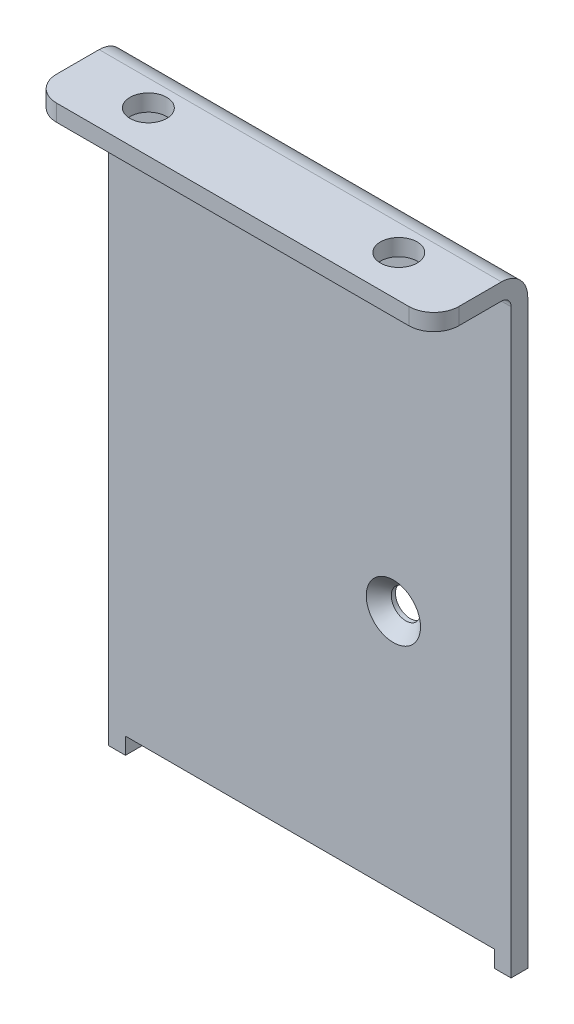
ISO-10303-21;
HEADER;
FILE_DESCRIPTION(('STEP AP214'),'2;1');
FILE_NAME('part.step','',(''),(''),'','','');
FILE_SCHEMA(('AUTOMOTIVE_DESIGN { 1 0 10303 214 1 1 1 1 }'));
ENDSEC;
DATA;
#1=APPLICATION_CONTEXT('core data for automotive mechanical design processes');
#2=APPLICATION_PROTOCOL_DEFINITION('international standard','automotive_design',2000,#1);
#3=PRODUCT_CONTEXT('',#1,'mechanical');
#4=PRODUCT('Part','Part','',(#3));
#5=PRODUCT_RELATED_PRODUCT_CATEGORY('part','',(#4));
#6=PRODUCT_DEFINITION_FORMATION('','',#4);
#7=PRODUCT_DEFINITION_CONTEXT('part definition',#1,'design');
#8=PRODUCT_DEFINITION('design','',#6,#7);
#9=PRODUCT_DEFINITION_SHAPE('','',#8);
#10=(LENGTH_UNIT() NAMED_UNIT(*) SI_UNIT(.MILLI.,.METRE.));
#11=(NAMED_UNIT(*) PLANE_ANGLE_UNIT() SI_UNIT($,.RADIAN.));
#12=(NAMED_UNIT(*) SI_UNIT($,.STERADIAN.) SOLID_ANGLE_UNIT());
#13=UNCERTAINTY_MEASURE_WITH_UNIT(LENGTH_MEASURE(1.E-05),#10,'distance_accuracy_value','');
#14=(GEOMETRIC_REPRESENTATION_CONTEXT(3) GLOBAL_UNCERTAINTY_ASSIGNED_CONTEXT((#13)) GLOBAL_UNIT_ASSIGNED_CONTEXT((#10,
#11,#12)) REPRESENTATION_CONTEXT('',''));
#15=CARTESIAN_POINT('',(0.,0.,0.));
#16=DIRECTION('',(0.,0.,1.));
#17=DIRECTION('',(1.,0.,0.));
#18=AXIS2_PLACEMENT_3D('',#15,#16,#17);
#19=CARTESIAN_POINT('',(24.1,57.8,0.));
#20=DIRECTION('',(0.,-1.,0.));
#21=DIRECTION('',(0.,0.,-1.));
#22=AXIS2_PLACEMENT_3D('',#19,#20,#21);
#23=PLANE('',#22);
#24=DIRECTION('',(0.,0.,1.));
#25=VECTOR('',#24,1.);
#26=CARTESIAN_POINT('',(-24.1,57.8,1.15));
#27=LINE('',#26,#25);
#28=CARTESIAN_POINT('',(-24.1,57.8,1.15));
#29=VERTEX_POINT('',#28);
#30=CARTESIAN_POINT('',(-24.1,57.8,6.25));
#31=VERTEX_POINT('',#30);
#32=EDGE_CURVE('E115',#29,#31,#27,.T.);
#33=ORIENTED_EDGE('',*,*,#32,.F.);
#34=DIRECTION('',(-1.,0.,0.));
#35=VECTOR('',#34,1.);
#36=CARTESIAN_POINT('',(24.1,57.8,1.15));
#37=LINE('',#36,#35);
#38=CARTESIAN_POINT('',(24.1,57.8,1.15));
#39=VERTEX_POINT('',#38);
#40=EDGE_CURVE('E145',#29,#39,#37,.F.);
#41=ORIENTED_EDGE('',*,*,#40,.T.);
#42=DIRECTION('',(0.,0.,-1.));
#43=VECTOR('',#42,1.);
#44=CARTESIAN_POINT('',(24.1,57.8,-2.));
#45=LINE('',#44,#43);
#46=CARTESIAN_POINT('',(24.1,57.8,6.25));
#47=VERTEX_POINT('',#46);
#48=EDGE_CURVE('E128',#47,#39,#45,.T.);
#49=ORIENTED_EDGE('',*,*,#48,.F.);
#50=CARTESIAN_POINT('',(21.1,57.8,6.25));
#51=DIRECTION('',(0.,1.,0.));
#52=DIRECTION('',(0.,0.,1.));
#53=AXIS2_PLACEMENT_3D('',#50,#51,#52);
#54=CIRCLE('',#53,3.);
#55=CARTESIAN_POINT('',(21.1,57.8,9.25));
#56=VERTEX_POINT('',#55);
#57=EDGE_CURVE('E139',#56,#47,#54,.T.);
#58=ORIENTED_EDGE('',*,*,#57,.F.);
#59=DIRECTION('',(1.,0.,0.));
#60=VECTOR('',#59,1.);
#61=CARTESIAN_POINT('',(24.1,57.8,9.25));
#62=LINE('',#61,#60);
#63=CARTESIAN_POINT('',(-21.1,57.8,9.25));
#64=VERTEX_POINT('',#63);
#65=EDGE_CURVE('E135',#64,#56,#62,.T.);
#66=ORIENTED_EDGE('',*,*,#65,.F.);
#67=CARTESIAN_POINT('',(-21.1,57.8,6.25));
#68=DIRECTION('',(0.,1.,0.));
#69=DIRECTION('',(0.,0.,1.));
#70=AXIS2_PLACEMENT_3D('',#67,#68,#69);
#71=CIRCLE('',#70,3.);
#72=EDGE_CURVE('E132',#31,#64,#71,.T.);
#73=ORIENTED_EDGE('',*,*,#72,.F.);
#74=EDGE_LOOP('',(#33,#41,#49,#58,#66,#73));
#75=FACE_BOUND('',#74,.T.);
#76=CARTESIAN_POINT('',(-15.1,57.8,4.25));
#77=DIRECTION('',(0.,1.,0.));
#78=DIRECTION('',(0.,0.,1.));
#79=AXIS2_PLACEMENT_3D('',#76,#77,#78);
#80=CIRCLE('',#79,2.2);
#81=CARTESIAN_POINT('',(-15.1,57.8,6.45));
#82=VERTEX_POINT('',#81);
#83=EDGE_CURVE('E140',#82,#82,#80,.T.);
#84=ORIENTED_EDGE('',*,*,#83,.T.);
#85=EDGE_LOOP('',(#84));
#86=FACE_BOUND('',#85,.T.);
#87=CARTESIAN_POINT('',(14.9,57.8,4.25));
#88=DIRECTION('',(0.,1.,0.));
#89=DIRECTION('',(0.,0.,1.));
#90=AXIS2_PLACEMENT_3D('',#87,#88,#89);
#91=CIRCLE('',#90,2.2);
#92=CARTESIAN_POINT('',(14.9,57.8,6.45));
#93=VERTEX_POINT('',#92);
#94=EDGE_CURVE('E20',#93,#93,#91,.T.);
#95=ORIENTED_EDGE('',*,*,#94,.T.);
#96=EDGE_LOOP('',(#95));
#97=FACE_BOUND('',#96,.T.);
#98=ADVANCED_FACE('F17',(#75,#86,#97),#23,.T.);
#99=CARTESIAN_POINT('',(14.9,59.8,4.25));
#100=DIRECTION('',(0.,1.,0.));
#101=DIRECTION('',(0.,0.,1.));
#102=AXIS2_PLACEMENT_3D('',#99,#100,#101);
#103=CYLINDRICAL_SURFACE('',#102,2.2);
#104=ORIENTED_EDGE('',*,*,#94,.F.);
#105=EDGE_LOOP('',(#104));
#106=FACE_BOUND('',#105,.T.);
#107=CARTESIAN_POINT('',(14.9,59.8,4.25));
#108=DIRECTION('',(0.,1.,0.));
#109=DIRECTION('',(0.,0.,1.));
#110=AXIS2_PLACEMENT_3D('',#107,#108,#109);
#111=CIRCLE('',#110,2.2);
#112=CARTESIAN_POINT('',(14.9,59.8,6.45));
#113=VERTEX_POINT('',#112);
#114=EDGE_CURVE('E147',#113,#113,#111,.T.);
#115=ORIENTED_EDGE('',*,*,#114,.T.);
#116=EDGE_LOOP('',(#115));
#117=FACE_BOUND('',#116,.T.);
#118=ADVANCED_FACE('F192',(#106,#117),#103,.F.);
#119=CARTESIAN_POINT('',(-15.1,59.8,4.25));
#120=DIRECTION('',(0.,1.,0.));
#121=DIRECTION('',(0.,0.,1.));
#122=AXIS2_PLACEMENT_3D('',#119,#120,#121);
#123=CYLINDRICAL_SURFACE('',#122,2.2);
#124=ORIENTED_EDGE('',*,*,#83,.F.);
#125=EDGE_LOOP('',(#124));
#126=FACE_BOUND('',#125,.T.);
#127=CARTESIAN_POINT('',(-15.1,59.8,4.25));
#128=DIRECTION('',(0.,1.,0.));
#129=DIRECTION('',(0.,0.,1.));
#130=AXIS2_PLACEMENT_3D('',#127,#128,#129);
#131=CIRCLE('',#130,2.2);
#132=CARTESIAN_POINT('',(-15.1,59.8,6.45));
#133=VERTEX_POINT('',#132);
#134=EDGE_CURVE('E181',#133,#133,#131,.T.);
#135=ORIENTED_EDGE('',*,*,#134,.T.);
#136=EDGE_LOOP('',(#135));
#137=FACE_BOUND('',#136,.T.);
#138=ADVANCED_FACE('F195',(#126,#137),#123,.F.);
#139=CARTESIAN_POINT('',(-21.1,56.65,6.25));
#140=DIRECTION('',(0.,1.,0.));
#141=DIRECTION('',(0.,0.,1.));
#142=AXIS2_PLACEMENT_3D('',#139,#140,#141);
#143=CYLINDRICAL_SURFACE('',#142,3.);
#144=CARTESIAN_POINT('',(-21.1,59.8,6.25));
#145=DIRECTION('',(0.,1.,0.));
#146=DIRECTION('',(0.,0.,1.));
#147=AXIS2_PLACEMENT_3D('',#144,#145,#146);
#148=CIRCLE('',#147,3.);
#149=CARTESIAN_POINT('',(-21.1,59.8,9.25));
#150=VERTEX_POINT('',#149);
#151=CARTESIAN_POINT('',(-24.1,59.8,6.25));
#152=VERTEX_POINT('',#151);
#153=EDGE_CURVE('E144',#150,#152,#148,.F.);
#154=ORIENTED_EDGE('',*,*,#153,.T.);
#155=DIRECTION('',(0.,1.,0.));
#156=VECTOR('',#155,1.);
#157=CARTESIAN_POINT('',(-24.1,56.65,6.25));
#158=LINE('',#157,#156);
#159=EDGE_CURVE('E121',#31,#152,#158,.T.);
#160=ORIENTED_EDGE('',*,*,#159,.F.);
#161=ORIENTED_EDGE('',*,*,#72,.T.);
#162=DIRECTION('',(0.,1.,0.));
#163=VECTOR('',#162,1.);
#164=CARTESIAN_POINT('',(-21.1,57.8,9.25));
#165=LINE('',#164,#163);
#166=EDGE_CURVE('E274',#150,#64,#165,.F.);
#167=ORIENTED_EDGE('',*,*,#166,.F.);
#168=EDGE_LOOP('',(#154,#160,#161,#167));
#169=FACE_BOUND('',#168,.T.);
#170=ADVANCED_FACE('F143',(#169),#143,.T.);
#171=CARTESIAN_POINT('',(21.1,57.8,6.25));
#172=DIRECTION('',(0.,1.,0.));
#173=DIRECTION('',(0.,0.,1.));
#174=AXIS2_PLACEMENT_3D('',#171,#172,#173);
#175=CYLINDRICAL_SURFACE('',#174,3.);
#176=CARTESIAN_POINT('',(21.1,59.8,6.25));
#177=DIRECTION('',(0.,1.,0.));
#178=DIRECTION('',(0.,0.,1.));
#179=AXIS2_PLACEMENT_3D('',#176,#177,#178);
#180=CIRCLE('',#179,3.);
#181=CARTESIAN_POINT('',(24.1,59.8,6.25));
#182=VERTEX_POINT('',#181);
#183=CARTESIAN_POINT('',(21.1,59.8,9.25));
#184=VERTEX_POINT('',#183);
#185=EDGE_CURVE('E175',#182,#184,#180,.F.);
#186=ORIENTED_EDGE('',*,*,#185,.T.);
#187=DIRECTION('',(0.,1.,0.));
#188=VECTOR('',#187,1.);
#189=CARTESIAN_POINT('',(21.1,57.8,9.25));
#190=LINE('',#189,#188);
#191=EDGE_CURVE('E154',#56,#184,#190,.T.);
#192=ORIENTED_EDGE('',*,*,#191,.F.);
#193=ORIENTED_EDGE('',*,*,#57,.T.);
#194=DIRECTION('',(0.,1.,0.));
#195=VECTOR('',#194,1.);
#196=CARTESIAN_POINT('',(24.1,56.65,6.25));
#197=LINE('',#196,#195);
#198=EDGE_CURVE('E151',#182,#47,#197,.F.);
#199=ORIENTED_EDGE('',*,*,#198,.F.);
#200=EDGE_LOOP('',(#186,#192,#193,#199));
#201=FACE_BOUND('',#200,.T.);
#202=ADVANCED_FACE('F373',(#201),#175,.T.);
#203=CARTESIAN_POINT('',(24.1,57.8,9.25));
#204=DIRECTION('',(0.,0.,1.));
#205=DIRECTION('',(1.,0.,0.));
#206=AXIS2_PLACEMENT_3D('',#203,#204,#205);
#207=PLANE('',#206);
#208=DIRECTION('',(1.,0.,0.));
#209=VECTOR('',#208,1.);
#210=CARTESIAN_POINT('',(24.1,59.8,9.25));
#211=LINE('',#210,#209);
#212=EDGE_CURVE('E174',#184,#150,#211,.F.);
#213=ORIENTED_EDGE('',*,*,#212,.T.);
#214=ORIENTED_EDGE('',*,*,#166,.T.);
#215=ORIENTED_EDGE('',*,*,#65,.T.);
#216=ORIENTED_EDGE('',*,*,#191,.T.);
#217=EDGE_LOOP('',(#213,#214,#215,#216));
#218=FACE_BOUND('',#217,.T.);
#219=ADVANCED_FACE('F374',(#218),#207,.T.);
#220=CARTESIAN_POINT('',(24.1,56.65,1.15));
#221=DIRECTION('',(-1.,0.,0.));
#222=DIRECTION('',(0.,0.,1.));
#223=AXIS2_PLACEMENT_3D('',#220,#221,#222);
#224=CYLINDRICAL_SURFACE('',#223,1.15);
#225=DIRECTION('',(1.,0.,0.));
#226=VECTOR('',#225,1.);
#227=CARTESIAN_POINT('',(24.1,56.65,0.));
#228=LINE('',#227,#226);
#229=CARTESIAN_POINT('',(24.1,56.65,0.));
#230=VERTEX_POINT('',#229);
#231=CARTESIAN_POINT('',(-24.1,56.65,0.));
#232=VERTEX_POINT('',#231);
#233=EDGE_CURVE('E170',#230,#232,#228,.F.);
#234=ORIENTED_EDGE('',*,*,#233,.F.);
#235=CARTESIAN_POINT('',(24.1,56.65,1.15));
#236=DIRECTION('',(-1.,0.,0.));
#237=DIRECTION('',(0.,0.,1.));
#238=AXIS2_PLACEMENT_3D('',#235,#236,#237);
#239=CIRCLE('',#238,1.15);
#240=EDGE_CURVE('E172',#39,#230,#239,.T.);
#241=ORIENTED_EDGE('',*,*,#240,.F.);
#242=ORIENTED_EDGE('',*,*,#40,.F.);
#243=CARTESIAN_POINT('',(-24.1,56.65,1.15));
#244=DIRECTION('',(-1.,0.,0.));
#245=DIRECTION('',(0.,0.,1.));
#246=AXIS2_PLACEMENT_3D('',#243,#244,#245);
#247=CIRCLE('',#246,1.15);
#248=EDGE_CURVE('E125',#232,#29,#247,.F.);
#249=ORIENTED_EDGE('',*,*,#248,.F.);
#250=EDGE_LOOP('',(#234,#241,#242,#249));
#251=FACE_BOUND('',#250,.T.);
#252=ADVANCED_FACE('F212',(#251),#224,.F.);
#253=CARTESIAN_POINT('',(10.,18.,0.));
#254=DIRECTION('',(0.,0.,1.));
#255=DIRECTION('',(1.,0.,0.));
#256=AXIS2_PLACEMENT_3D('',#253,#254,#255);
#257=CONICAL_SURFACE('',#256,3.25000000008458,0.785398163397448);
#258=CARTESIAN_POINT('',(10.,18.,-1.49999999999999));
#259=DIRECTION('',(0.,0.,1.));
#260=DIRECTION('',(1.,0.,0.));
#261=AXIS2_PLACEMENT_3D('',#258,#259,#260);
#262=CIRCLE('',#261,1.75);
#263=CARTESIAN_POINT('',(11.75,18.,-1.49999999999999));
#264=VERTEX_POINT('',#263);
#265=EDGE_CURVE('E263',#264,#264,#262,.F.);
#266=ORIENTED_EDGE('',*,*,#265,.T.);
#267=EDGE_LOOP('',(#266));
#268=FACE_BOUND('',#267,.T.);
#269=CARTESIAN_POINT('',(10.,18.,0.));
#270=DIRECTION('',(0.,0.,1.));
#271=DIRECTION('',(1.,0.,0.));
#272=AXIS2_PLACEMENT_3D('',#269,#270,#271);
#273=CIRCLE('',#272,3.25000000008458);
#274=CARTESIAN_POINT('',(13.2500000000846,18.,0.));
#275=VERTEX_POINT('',#274);
#276=EDGE_CURVE('E167',#275,#275,#273,.F.);
#277=ORIENTED_EDGE('',*,*,#276,.F.);
#278=EDGE_LOOP('',(#277));
#279=FACE_BOUND('',#278,.T.);
#280=ADVANCED_FACE('F201',(#268,#279),#257,.F.);
#281=CARTESIAN_POINT('',(24.1,59.8,0.));
#282=DIRECTION('',(0.,-1.,0.));
#283=DIRECTION('',(0.,0.,-1.));
#284=AXIS2_PLACEMENT_3D('',#281,#282,#283);
#285=PLANE('',#284);
#286=ORIENTED_EDGE('',*,*,#185,.F.);
#287=DIRECTION('',(0.,0.,-1.));
#288=VECTOR('',#287,1.);
#289=CARTESIAN_POINT('',(24.1,59.8,0.));
#290=LINE('',#289,#288);
#291=CARTESIAN_POINT('',(24.1,59.8,1.15));
#292=VERTEX_POINT('',#291);
#293=EDGE_CURVE('E178',#292,#182,#290,.F.);
#294=ORIENTED_EDGE('',*,*,#293,.F.);
#295=DIRECTION('',(-1.,0.,0.));
#296=VECTOR('',#295,1.);
#297=CARTESIAN_POINT('',(24.1,59.8,1.15));
#298=LINE('',#297,#296);
#299=CARTESIAN_POINT('',(-24.1,59.8,1.15));
#300=VERTEX_POINT('',#299);
#301=EDGE_CURVE('E163',#300,#292,#298,.F.);
#302=ORIENTED_EDGE('',*,*,#301,.F.);
#303=DIRECTION('',(0.,0.,-1.));
#304=VECTOR('',#303,1.);
#305=CARTESIAN_POINT('',(-24.1,59.8,0.));
#306=LINE('',#305,#304);
#307=EDGE_CURVE('E180',#152,#300,#306,.T.);
#308=ORIENTED_EDGE('',*,*,#307,.F.);
#309=ORIENTED_EDGE('',*,*,#153,.F.);
#310=ORIENTED_EDGE('',*,*,#212,.F.);
#311=EDGE_LOOP('',(#286,#294,#302,#308,#309,#310));
#312=FACE_BOUND('',#311,.T.);
#313=ORIENTED_EDGE('',*,*,#134,.F.);
#314=EDGE_LOOP('',(#313));
#315=FACE_BOUND('',#314,.T.);
#316=ORIENTED_EDGE('',*,*,#114,.F.);
#317=EDGE_LOOP('',(#316));
#318=FACE_BOUND('',#317,.T.);
#319=ADVANCED_FACE('F198',(#312,#315,#318),#285,.F.);
#320=CARTESIAN_POINT('',(24.1,-13.,0.));
#321=DIRECTION('',(0.,0.,1.));
#322=DIRECTION('',(1.,0.,0.));
#323=AXIS2_PLACEMENT_3D('',#320,#321,#322);
#324=PLANE('',#323);
#325=DIRECTION('',(0.,1.,0.));
#326=VECTOR('',#325,1.);
#327=CARTESIAN_POINT('',(-24.1,59.8,0.));
#328=LINE('',#327,#326);
#329=CARTESIAN_POINT('',(-24.1,-13.,0.));
#330=VERTEX_POINT('',#329);
#331=EDGE_CURVE('E162',#330,#232,#328,.T.);
#332=ORIENTED_EDGE('',*,*,#331,.F.);
#333=DIRECTION('',(1.,0.,0.));
#334=VECTOR('',#333,1.);
#335=CARTESIAN_POINT('',(24.1,-13.,0.));
#336=LINE('',#335,#334);
#337=CARTESIAN_POINT('',(-22.1,-13.,0.));
#338=VERTEX_POINT('',#337);
#339=EDGE_CURVE('E340',#338,#330,#336,.F.);
#340=ORIENTED_EDGE('',*,*,#339,.F.);
#341=DIRECTION('',(0.,-1.,0.));
#342=VECTOR('',#341,1.);
#343=CARTESIAN_POINT('',(-22.1,-13.,0.));
#344=LINE('',#343,#342);
#345=CARTESIAN_POINT('',(-22.1,-11.,0.));
#346=VERTEX_POINT('',#345);
#347=EDGE_CURVE('E324',#338,#346,#344,.F.);
#348=ORIENTED_EDGE('',*,*,#347,.T.);
#349=DIRECTION('',(1.,0.,0.));
#350=VECTOR('',#349,1.);
#351=CARTESIAN_POINT('',(-22.1,-11.,0.));
#352=LINE('',#351,#350);
#353=CARTESIAN_POINT('',(22.1,-11.,0.));
#354=VERTEX_POINT('',#353);
#355=EDGE_CURVE('E159',#346,#354,#352,.T.);
#356=ORIENTED_EDGE('',*,*,#355,.T.);
#357=DIRECTION('',(0.,1.,0.));
#358=VECTOR('',#357,1.);
#359=CARTESIAN_POINT('',(22.1,-13.,0.));
#360=LINE('',#359,#358);
#361=CARTESIAN_POINT('',(22.1,-13.,0.));
#362=VERTEX_POINT('',#361);
#363=EDGE_CURVE('E264',#354,#362,#360,.F.);
#364=ORIENTED_EDGE('',*,*,#363,.T.);
#365=DIRECTION('',(1.,0.,0.));
#366=VECTOR('',#365,1.);
#367=CARTESIAN_POINT('',(24.1,-13.,0.));
#368=LINE('',#367,#366);
#369=CARTESIAN_POINT('',(24.1,-13.,0.));
#370=VERTEX_POINT('',#369);
#371=EDGE_CURVE('E295',#370,#362,#368,.F.);
#372=ORIENTED_EDGE('',*,*,#371,.F.);
#373=DIRECTION('',(0.,1.,0.));
#374=VECTOR('',#373,1.);
#375=CARTESIAN_POINT('',(24.1,56.65,0.));
#376=LINE('',#375,#374);
#377=EDGE_CURVE('E166',#370,#230,#376,.T.);
#378=ORIENTED_EDGE('',*,*,#377,.T.);
#379=ORIENTED_EDGE('',*,*,#233,.T.);
#380=EDGE_LOOP('',(#332,#340,#348,#356,#364,#372,#378,#379));
#381=FACE_BOUND('',#380,.T.);
#382=ORIENTED_EDGE('',*,*,#276,.T.);
#383=EDGE_LOOP('',(#382));
#384=FACE_BOUND('',#383,.T.);
#385=ADVANCED_FACE('F200',(#381,#384),#324,.T.);
#386=CARTESIAN_POINT('',(10.,18.,-2.));
#387=DIRECTION('',(0.,0.,1.));
#388=DIRECTION('',(1.,0.,0.));
#389=AXIS2_PLACEMENT_3D('',#386,#387,#388);
#390=CYLINDRICAL_SURFACE('',#389,1.75);
#391=CARTESIAN_POINT('',(10.,18.,-2.));
#392=DIRECTION('',(0.,0.,1.));
#393=DIRECTION('',(1.,0.,0.));
#394=AXIS2_PLACEMENT_3D('',#391,#392,#393);
#395=CIRCLE('',#394,1.75);
#396=CARTESIAN_POINT('',(11.75,18.,-2.));
#397=VERTEX_POINT('',#396);
#398=EDGE_CURVE('E155',#397,#397,#395,.F.);
#399=ORIENTED_EDGE('',*,*,#398,.T.);
#400=EDGE_LOOP('',(#399));
#401=FACE_BOUND('',#400,.T.);
#402=ORIENTED_EDGE('',*,*,#265,.F.);
#403=EDGE_LOOP('',(#402));
#404=FACE_BOUND('',#403,.T.);
#405=ADVANCED_FACE('F209',(#401,#404),#390,.F.);
#406=CARTESIAN_POINT('',(22.1,-13.,-2.));
#407=DIRECTION('',(1.,0.,0.));
#408=DIRECTION('',(0.,0.,-1.));
#409=AXIS2_PLACEMENT_3D('',#406,#407,#408);
#410=PLANE('',#409);
#411=DIRECTION('',(0.,0.,1.));
#412=VECTOR('',#411,1.);
#413=CARTESIAN_POINT('',(22.1,-11.,-2.));
#414=LINE('',#413,#412);
#415=CARTESIAN_POINT('',(22.1,-11.,-2.));
#416=VERTEX_POINT('',#415);
#417=EDGE_CURVE('E321',#354,#416,#414,.F.);
#418=ORIENTED_EDGE('',*,*,#417,.T.);
#419=DIRECTION('',(0.,1.,0.));
#420=VECTOR('',#419,1.);
#421=CARTESIAN_POINT('',(22.1,-13.,-2.));
#422=LINE('',#421,#420);
#423=CARTESIAN_POINT('',(22.1,-13.,-2.));
#424=VERTEX_POINT('',#423);
#425=EDGE_CURVE('E158',#416,#424,#422,.F.);
#426=ORIENTED_EDGE('',*,*,#425,.T.);
#427=DIRECTION('',(0.,0.,-1.));
#428=VECTOR('',#427,1.);
#429=CARTESIAN_POINT('',(22.1,-13.,-2.));
#430=LINE('',#429,#428);
#431=EDGE_CURVE('E266',#362,#424,#430,.T.);
#432=ORIENTED_EDGE('',*,*,#431,.F.);
#433=ORIENTED_EDGE('',*,*,#363,.F.);
#434=EDGE_LOOP('',(#418,#426,#432,#433));
#435=FACE_BOUND('',#434,.T.);
#436=ADVANCED_FACE('F250',(#435),#410,.F.);
#437=CARTESIAN_POINT('',(24.1,-13.,-2.));
#438=DIRECTION('',(0.,-1.,0.));
#439=DIRECTION('',(0.,0.,-1.));
#440=AXIS2_PLACEMENT_3D('',#437,#438,#439);
#441=PLANE('',#440);
#442=DIRECTION('',(0.,0.,1.));
#443=VECTOR('',#442,1.);
#444=CARTESIAN_POINT('',(24.1,-13.,1.15));
#445=LINE('',#444,#443);
#446=CARTESIAN_POINT('',(24.1,-13.,-2.));
#447=VERTEX_POINT('',#446);
#448=EDGE_CURVE('E290',#447,#370,#445,.T.);
#449=ORIENTED_EDGE('',*,*,#448,.T.);
#450=ORIENTED_EDGE('',*,*,#371,.T.);
#451=ORIENTED_EDGE('',*,*,#431,.T.);
#452=DIRECTION('',(1.,0.,0.));
#453=VECTOR('',#452,1.);
#454=CARTESIAN_POINT('',(24.1,-13.,-2.));
#455=LINE('',#454,#453);
#456=EDGE_CURVE('E298',#424,#447,#455,.T.);
#457=ORIENTED_EDGE('',*,*,#456,.T.);
#458=EDGE_LOOP('',(#449,#450,#451,#457));
#459=FACE_BOUND('',#458,.T.);
#460=ADVANCED_FACE('F246',(#459),#441,.T.);
#461=CARTESIAN_POINT('',(24.1,56.65,1.15));
#462=DIRECTION('',(-1.,0.,0.));
#463=DIRECTION('',(0.,0.,1.));
#464=AXIS2_PLACEMENT_3D('',#461,#462,#463);
#465=PLANE('',#464);
#466=DIRECTION('',(0.,1.,0.));
#467=VECTOR('',#466,1.);
#468=CARTESIAN_POINT('',(24.1,-13.,-2.));
#469=LINE('',#468,#467);
#470=CARTESIAN_POINT('',(24.1,56.65,-2.));
#471=VERTEX_POINT('',#470);
#472=EDGE_CURVE('E309',#447,#471,#469,.T.);
#473=ORIENTED_EDGE('',*,*,#472,.T.);
#474=CARTESIAN_POINT('',(24.1,56.65,1.15));
#475=DIRECTION('',(-1.,0.,0.));
#476=DIRECTION('',(0.,0.,1.));
#477=AXIS2_PLACEMENT_3D('',#474,#475,#476);
#478=CIRCLE('',#477,3.15);
#479=EDGE_CURVE('E160',#292,#471,#478,.T.);
#480=ORIENTED_EDGE('',*,*,#479,.F.);
#481=ORIENTED_EDGE('',*,*,#293,.T.);
#482=ORIENTED_EDGE('',*,*,#198,.T.);
#483=ORIENTED_EDGE('',*,*,#48,.T.);
#484=ORIENTED_EDGE('',*,*,#240,.T.);
#485=ORIENTED_EDGE('',*,*,#377,.F.);
#486=ORIENTED_EDGE('',*,*,#448,.F.);
#487=EDGE_LOOP('',(#473,#480,#481,#482,#483,#484,#485,#486));
#488=FACE_BOUND('',#487,.T.);
#489=ADVANCED_FACE('F242',(#488),#465,.F.);
#490=CARTESIAN_POINT('',(24.1,56.65,1.15));
#491=DIRECTION('',(-1.,0.,0.));
#492=DIRECTION('',(0.,0.,1.));
#493=AXIS2_PLACEMENT_3D('',#490,#491,#492);
#494=CYLINDRICAL_SURFACE('',#493,3.15);
#495=ORIENTED_EDGE('',*,*,#479,.T.);
#496=DIRECTION('',(1.,0.,0.));
#497=VECTOR('',#496,1.);
#498=CARTESIAN_POINT('',(24.1,56.65,-2.));
#499=LINE('',#498,#497);
#500=CARTESIAN_POINT('',(-24.1,56.65,-2.));
#501=VERTEX_POINT('',#500);
#502=EDGE_CURVE('E345',#471,#501,#499,.F.);
#503=ORIENTED_EDGE('',*,*,#502,.T.);
#504=CARTESIAN_POINT('',(-24.1,56.65,1.15));
#505=DIRECTION('',(-1.,0.,0.));
#506=DIRECTION('',(0.,0.,1.));
#507=AXIS2_PLACEMENT_3D('',#504,#505,#506);
#508=CIRCLE('',#507,3.15);
#509=EDGE_CURVE('E164',#501,#300,#508,.F.);
#510=ORIENTED_EDGE('',*,*,#509,.T.);
#511=ORIENTED_EDGE('',*,*,#301,.T.);
#512=EDGE_LOOP('',(#495,#503,#510,#511));
#513=FACE_BOUND('',#512,.T.);
#514=ADVANCED_FACE('F239',(#513),#494,.T.);
#515=CARTESIAN_POINT('',(-24.1,59.8,1.15));
#516=DIRECTION('',(-1.,0.,0.));
#517=DIRECTION('',(0.,0.,1.));
#518=AXIS2_PLACEMENT_3D('',#515,#516,#517);
#519=PLANE('',#518);
#520=DIRECTION('',(0.,1.,0.));
#521=VECTOR('',#520,1.);
#522=CARTESIAN_POINT('',(-24.1,-13.,-2.));
#523=LINE('',#522,#521);
#524=CARTESIAN_POINT('',(-24.1,-13.,-2.));
#525=VERTEX_POINT('',#524);
#526=EDGE_CURVE('E343',#501,#525,#523,.F.);
#527=ORIENTED_EDGE('',*,*,#526,.T.);
#528=DIRECTION('',(0.,0.,-1.));
#529=VECTOR('',#528,1.);
#530=CARTESIAN_POINT('',(-24.1,-13.,-2.));
#531=LINE('',#530,#529);
#532=EDGE_CURVE('E338',#330,#525,#531,.T.);
#533=ORIENTED_EDGE('',*,*,#532,.F.);
#534=ORIENTED_EDGE('',*,*,#331,.T.);
#535=ORIENTED_EDGE('',*,*,#248,.T.);
#536=ORIENTED_EDGE('',*,*,#32,.T.);
#537=ORIENTED_EDGE('',*,*,#159,.T.);
#538=ORIENTED_EDGE('',*,*,#307,.T.);
#539=ORIENTED_EDGE('',*,*,#509,.F.);
#540=EDGE_LOOP('',(#527,#533,#534,#535,#536,#537,#538,#539));
#541=FACE_BOUND('',#540,.T.);
#542=ADVANCED_FACE('F118',(#541),#519,.T.);
#543=CARTESIAN_POINT('',(24.1,-13.,-2.));
#544=DIRECTION('',(0.,-1.,0.));
#545=DIRECTION('',(0.,0.,-1.));
#546=AXIS2_PLACEMENT_3D('',#543,#544,#545);
#547=PLANE('',#546);
#548=ORIENTED_EDGE('',*,*,#532,.T.);
#549=DIRECTION('',(1.,0.,0.));
#550=VECTOR('',#549,1.);
#551=CARTESIAN_POINT('',(24.1,-13.,-2.));
#552=LINE('',#551,#550);
#553=CARTESIAN_POINT('',(-22.1,-13.,-2.));
#554=VERTEX_POINT('',#553);
#555=EDGE_CURVE('E332',#525,#554,#552,.T.);
#556=ORIENTED_EDGE('',*,*,#555,.T.);
#557=DIRECTION('',(0.,0.,1.));
#558=VECTOR('',#557,1.);
#559=CARTESIAN_POINT('',(-22.1,-13.,-2.));
#560=LINE('',#559,#558);
#561=EDGE_CURVE('E335',#554,#338,#560,.T.);
#562=ORIENTED_EDGE('',*,*,#561,.T.);
#563=ORIENTED_EDGE('',*,*,#339,.T.);
#564=EDGE_LOOP('',(#548,#556,#562,#563));
#565=FACE_BOUND('',#564,.T.);
#566=ADVANCED_FACE('F232',(#565),#547,.T.);
#567=CARTESIAN_POINT('',(-22.1,-13.,-2.));
#568=DIRECTION('',(-1.,0.,0.));
#569=DIRECTION('',(0.,-1.,0.));
#570=AXIS2_PLACEMENT_3D('',#567,#568,#569);
#571=PLANE('',#570);
#572=ORIENTED_EDGE('',*,*,#561,.F.);
#573=DIRECTION('',(0.,1.,0.));
#574=VECTOR('',#573,1.);
#575=CARTESIAN_POINT('',(-22.1,-13.,-2.));
#576=LINE('',#575,#574);
#577=CARTESIAN_POINT('',(-22.1,-11.,-2.));
#578=VERTEX_POINT('',#577);
#579=EDGE_CURVE('E26',#554,#578,#576,.T.);
#580=ORIENTED_EDGE('',*,*,#579,.T.);
#581=DIRECTION('',(0.,0.,1.));
#582=VECTOR('',#581,1.);
#583=CARTESIAN_POINT('',(-22.1,-11.,-2.));
#584=LINE('',#583,#582);
#585=EDGE_CURVE('E34',#578,#346,#584,.T.);
#586=ORIENTED_EDGE('',*,*,#585,.T.);
#587=ORIENTED_EDGE('',*,*,#347,.F.);
#588=EDGE_LOOP('',(#572,#580,#586,#587));
#589=FACE_BOUND('',#588,.T.);
#590=ADVANCED_FACE('F225',(#589),#571,.F.);
#591=CARTESIAN_POINT('',(-22.1,-11.,-2.));
#592=DIRECTION('',(0.,1.,0.));
#593=DIRECTION('',(0.,0.,1.));
#594=AXIS2_PLACEMENT_3D('',#591,#592,#593);
#595=PLANE('',#594);
#596=ORIENTED_EDGE('',*,*,#585,.F.);
#597=DIRECTION('',(1.,0.,0.));
#598=VECTOR('',#597,1.);
#599=CARTESIAN_POINT('',(24.1,-11.,-2.));
#600=LINE('',#599,#598);
#601=EDGE_CURVE('E11',#578,#416,#600,.T.);
#602=ORIENTED_EDGE('',*,*,#601,.T.);
#603=ORIENTED_EDGE('',*,*,#417,.F.);
#604=ORIENTED_EDGE('',*,*,#355,.F.);
#605=EDGE_LOOP('',(#596,#602,#603,#604));
#606=FACE_BOUND('',#605,.T.);
#607=ADVANCED_FACE('F219',(#606),#595,.F.);
#608=CARTESIAN_POINT('',(24.1,-13.,-2.));
#609=DIRECTION('',(0.,0.,1.));
#610=DIRECTION('',(1.,0.,0.));
#611=AXIS2_PLACEMENT_3D('',#608,#609,#610);
#612=PLANE('',#611);
#613=ORIENTED_EDGE('',*,*,#579,.F.);
#614=ORIENTED_EDGE('',*,*,#555,.F.);
#615=ORIENTED_EDGE('',*,*,#526,.F.);
#616=ORIENTED_EDGE('',*,*,#502,.F.);
#617=ORIENTED_EDGE('',*,*,#472,.F.);
#618=ORIENTED_EDGE('',*,*,#456,.F.);
#619=ORIENTED_EDGE('',*,*,#425,.F.);
#620=ORIENTED_EDGE('',*,*,#601,.F.);
#621=EDGE_LOOP('',(#613,#614,#615,#616,#617,#618,#619,#620));
#622=FACE_BOUND('',#621,.T.);
#623=ORIENTED_EDGE('',*,*,#398,.F.);
#624=EDGE_LOOP('',(#623));
#625=FACE_BOUND('',#624,.T.);
#626=ADVANCED_FACE('F217',(#622,#625),#612,.F.);
#627=CLOSED_SHELL('',(#98,#118,#138,#170,#202,#219,#252,#280,#319,#385,#405,#436,#460,#489,#514,
#542,#566,#590,#607,#626));
#628=MANIFOLD_SOLID_BREP('B1',#627);
#629=ADVANCED_BREP_SHAPE_REPRESENTATION('',(#18,#628),#14);
#630=SHAPE_DEFINITION_REPRESENTATION(#9,#629);
ENDSEC;
END-ISO-10303-21;
